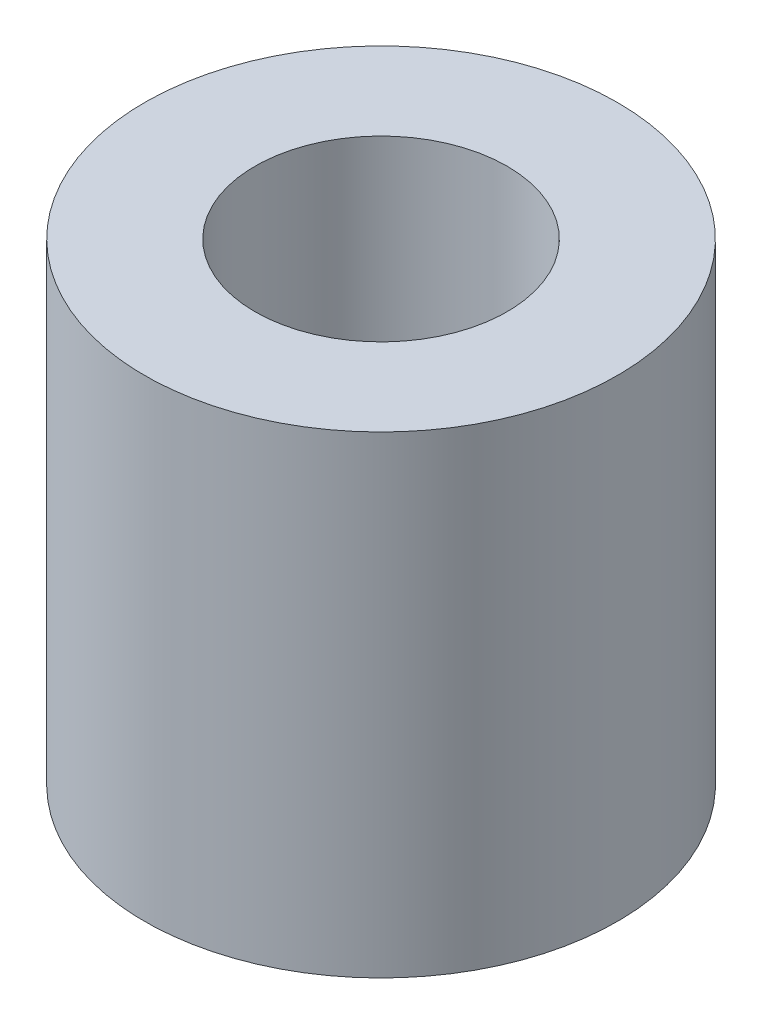
ISO-10303-21;
HEADER;
FILE_DESCRIPTION(('STEP AP214'),'2;1');
FILE_NAME('part.step','',(''),(''),'','','');
FILE_SCHEMA(('AUTOMOTIVE_DESIGN { 1 0 10303 214 1 1 1 1 }'));
ENDSEC;
DATA;
#1=APPLICATION_CONTEXT('core data for automotive mechanical design processes');
#2=APPLICATION_PROTOCOL_DEFINITION('international standard','automotive_design',2000,#1);
#3=PRODUCT_CONTEXT('',#1,'mechanical');
#4=PRODUCT('Part','Part','',(#3));
#5=PRODUCT_RELATED_PRODUCT_CATEGORY('part','',(#4));
#6=PRODUCT_DEFINITION_FORMATION('','',#4);
#7=PRODUCT_DEFINITION_CONTEXT('part definition',#1,'design');
#8=PRODUCT_DEFINITION('design','',#6,#7);
#9=PRODUCT_DEFINITION_SHAPE('','',#8);
#10=(LENGTH_UNIT() NAMED_UNIT(*) SI_UNIT(.MILLI.,.METRE.));
#11=(NAMED_UNIT(*) PLANE_ANGLE_UNIT() SI_UNIT($,.RADIAN.));
#12=(NAMED_UNIT(*) SI_UNIT($,.STERADIAN.) SOLID_ANGLE_UNIT());
#13=UNCERTAINTY_MEASURE_WITH_UNIT(LENGTH_MEASURE(1.E-05),#10,'distance_accuracy_value','');
#14=(GEOMETRIC_REPRESENTATION_CONTEXT(3) GLOBAL_UNCERTAINTY_ASSIGNED_CONTEXT((#13)) GLOBAL_UNIT_ASSIGNED_CONTEXT((#10,
#11,#12)) REPRESENTATION_CONTEXT('',''));
#15=CARTESIAN_POINT('',(0.,0.,0.));
#16=DIRECTION('',(0.,0.,1.));
#17=DIRECTION('',(1.,0.,0.));
#18=AXIS2_PLACEMENT_3D('',#15,#16,#17);
#19=CARTESIAN_POINT('',(0.,9.525,0.));
#20=DIRECTION('',(0.,1.,0.));
#21=DIRECTION('',(0.,0.,1.));
#22=AXIS2_PLACEMENT_3D('',#19,#20,#21);
#23=PLANE('',#22);
#24=CARTESIAN_POINT('',(0.,9.525,0.));
#25=DIRECTION('',(0.,1.,0.));
#26=DIRECTION('',(0.,0.,1.));
#27=AXIS2_PLACEMENT_3D('',#24,#25,#26);
#28=CIRCLE('',#27,4.7625);
#29=CARTESIAN_POINT('',(0.,9.525,-4.7625));
#30=VERTEX_POINT('',#29);
#31=EDGE_CURVE('E10',#30,#30,#28,.T.);
#32=ORIENTED_EDGE('',*,*,#31,.T.);
#33=EDGE_LOOP('',(#32));
#34=FACE_BOUND('',#33,.T.);
#35=CARTESIAN_POINT('',(0.,9.525,0.));
#36=DIRECTION('',(0.,1.,0.));
#37=DIRECTION('',(0.,0.,1.));
#38=AXIS2_PLACEMENT_3D('',#35,#36,#37);
#39=CIRCLE('',#38,2.54);
#40=CARTESIAN_POINT('',(0.,9.525,-2.54));
#41=VERTEX_POINT('',#40);
#42=EDGE_CURVE('E47',#41,#41,#39,.T.);
#43=ORIENTED_EDGE('',*,*,#42,.F.);
#44=EDGE_LOOP('',(#43));
#45=FACE_BOUND('',#44,.T.);
#46=ADVANCED_FACE('F36',(#34,#45),#23,.T.);
#47=CARTESIAN_POINT('',(0.,0.,0.));
#48=DIRECTION('',(0.,1.,0.));
#49=DIRECTION('',(0.,0.,1.));
#50=AXIS2_PLACEMENT_3D('',#47,#48,#49);
#51=PLANE('',#50);
#52=CARTESIAN_POINT('',(0.,0.,0.));
#53=DIRECTION('',(0.,1.,0.));
#54=DIRECTION('',(0.,0.,1.));
#55=AXIS2_PLACEMENT_3D('',#52,#53,#54);
#56=CIRCLE('',#55,4.7625);
#57=CARTESIAN_POINT('',(0.,0.,-4.7625));
#58=VERTEX_POINT('',#57);
#59=EDGE_CURVE('E40',#58,#58,#56,.T.);
#60=ORIENTED_EDGE('',*,*,#59,.F.);
#61=EDGE_LOOP('',(#60));
#62=FACE_BOUND('',#61,.T.);
#63=CARTESIAN_POINT('',(0.,0.,0.));
#64=DIRECTION('',(0.,1.,0.));
#65=DIRECTION('',(0.,0.,1.));
#66=AXIS2_PLACEMENT_3D('',#63,#64,#65);
#67=CIRCLE('',#66,2.54);
#68=CARTESIAN_POINT('',(0.,0.,-2.54));
#69=VERTEX_POINT('',#68);
#70=EDGE_CURVE('E49',#69,#69,#67,.T.);
#71=ORIENTED_EDGE('',*,*,#70,.T.);
#72=EDGE_LOOP('',(#71));
#73=FACE_BOUND('',#72,.T.);
#74=ADVANCED_FACE('F59',(#62,#73),#51,.F.);
#75=CARTESIAN_POINT('',(0.,9.525,0.));
#76=DIRECTION('',(0.,-1.,0.));
#77=DIRECTION('',(0.,0.,-1.));
#78=AXIS2_PLACEMENT_3D('',#75,#76,#77);
#79=CYLINDRICAL_SURFACE('',#78,4.7625);
#80=CARTESIAN_POINT('',(0.,9.525,-4.7625));
#81=CARTESIAN_POINT('',(0.,9.42578125,-4.7625));
#82=CARTESIAN_POINT('',(0.,9.3265625,-4.7625));
#83=CARTESIAN_POINT('',(0.,9.128125,-4.7625));
#84=CARTESIAN_POINT('',(0.,9.02890625,-4.7625));
#85=CARTESIAN_POINT('',(0.,8.83046875,-4.7625));
#86=CARTESIAN_POINT('',(0.,8.73125,-4.7625));
#87=CARTESIAN_POINT('',(0.,8.5328125,-4.7625));
#88=CARTESIAN_POINT('',(0.,8.43359375,-4.7625));
#89=CARTESIAN_POINT('',(0.,8.23515625,-4.7625));
#90=CARTESIAN_POINT('',(0.,8.1359375,-4.7625));
#91=CARTESIAN_POINT('',(0.,7.9375,-4.7625));
#92=CARTESIAN_POINT('',(0.,7.83828125,-4.7625));
#93=CARTESIAN_POINT('',(0.,7.63984375,-4.7625));
#94=CARTESIAN_POINT('',(0.,7.540625,-4.7625));
#95=CARTESIAN_POINT('',(0.,7.3421875,-4.7625));
#96=CARTESIAN_POINT('',(0.,7.24296875,-4.7625));
#97=CARTESIAN_POINT('',(0.,7.04453125,-4.7625));
#98=CARTESIAN_POINT('',(0.,6.9453125,-4.7625));
#99=CARTESIAN_POINT('',(0.,6.746875,-4.7625));
#100=CARTESIAN_POINT('',(0.,6.64765625,-4.7625));
#101=CARTESIAN_POINT('',(0.,6.44921875,-4.7625));
#102=CARTESIAN_POINT('',(0.,6.35,-4.7625));
#103=CARTESIAN_POINT('',(0.,6.1515625,-4.7625));
#104=CARTESIAN_POINT('',(0.,6.05234375,-4.7625));
#105=CARTESIAN_POINT('',(0.,5.85390625,-4.7625));
#106=CARTESIAN_POINT('',(0.,5.7546875,-4.7625));
#107=CARTESIAN_POINT('',(0.,5.55625,-4.7625));
#108=CARTESIAN_POINT('',(0.,5.45703125,-4.7625));
#109=CARTESIAN_POINT('',(0.,5.25859375,-4.7625));
#110=CARTESIAN_POINT('',(0.,5.159375,-4.7625));
#111=CARTESIAN_POINT('',(0.,4.9609375,-4.7625));
#112=CARTESIAN_POINT('',(0.,4.86171875,-4.7625));
#113=CARTESIAN_POINT('',(0.,4.66328125,-4.7625));
#114=CARTESIAN_POINT('',(0.,4.5640625,-4.7625));
#115=CARTESIAN_POINT('',(0.,4.365625,-4.7625));
#116=CARTESIAN_POINT('',(0.,4.26640625,-4.7625));
#117=CARTESIAN_POINT('',(0.,4.06796875,-4.7625));
#118=CARTESIAN_POINT('',(0.,3.96875,-4.7625));
#119=CARTESIAN_POINT('',(0.,3.7703125,-4.7625));
#120=CARTESIAN_POINT('',(0.,3.67109375,-4.7625));
#121=CARTESIAN_POINT('',(0.,3.47265625,-4.7625));
#122=CARTESIAN_POINT('',(0.,3.3734375,-4.7625));
#123=CARTESIAN_POINT('',(0.,3.175,-4.7625));
#124=CARTESIAN_POINT('',(0.,3.07578125,-4.7625));
#125=CARTESIAN_POINT('',(0.,2.87734375,-4.7625));
#126=CARTESIAN_POINT('',(0.,2.778125,-4.7625));
#127=CARTESIAN_POINT('',(0.,2.5796875,-4.7625));
#128=CARTESIAN_POINT('',(0.,2.48046875,-4.7625));
#129=CARTESIAN_POINT('',(0.,2.28203125,-4.7625));
#130=CARTESIAN_POINT('',(0.,2.1828125,-4.7625));
#131=CARTESIAN_POINT('',(0.,1.984375,-4.7625));
#132=CARTESIAN_POINT('',(0.,1.88515625,-4.7625));
#133=CARTESIAN_POINT('',(0.,1.68671875,-4.7625));
#134=CARTESIAN_POINT('',(0.,1.5875,-4.7625));
#135=CARTESIAN_POINT('',(0.,1.3890625,-4.7625));
#136=CARTESIAN_POINT('',(0.,1.28984375,-4.7625));
#137=CARTESIAN_POINT('',(0.,1.09140625,-4.7625));
#138=CARTESIAN_POINT('',(0.,0.992187500000001,-4.7625));
#139=CARTESIAN_POINT('',(0.,0.793750000000001,-4.7625));
#140=CARTESIAN_POINT('',(0.,0.69453125,-4.7625));
#141=CARTESIAN_POINT('',(0.,0.49609375,-4.7625));
#142=CARTESIAN_POINT('',(0.,0.396875,-4.7625));
#143=CARTESIAN_POINT('',(0.,0.1984375,-4.7625));
#144=CARTESIAN_POINT('',(0.,0.0992187500000001,-4.7625));
#145=CARTESIAN_POINT('',(0.,0.,-4.7625));
#146=B_SPLINE_CURVE_WITH_KNOTS('',3,(#80,#81,#82,#83,#84,#85,#86,#87,#88,#89,#90,#91,#92,#93,
#94,#95,#96,#97,#98,#99,#100,#101,#102,#103,#104,#105,#106,#107,#108,#109,#110,#111,#112,#113,
#114,#115,#116,#117,#118,#119,#120,#121,#122,#123,#124,#125,#126,#127,#128,#129,#130,#131,#132,
#133,#134,#135,#136,#137,#138,#139,#140,#141,#142,#143,#144,#145),.UNSPECIFIED.,.F.,.F.,(4,2,2,
2,2,2,2,2,2,2,2,2,2,2,2,2,2,2,2,2,2,2,2,2,2,2,2,2,2,2,2,2,4),(0.,0.29765625,0.5953125,
0.892968750000001,1.190625,1.48828125,1.7859375,2.08359375,2.38125,2.67890625,2.9765625,
3.27421875,3.571875,3.86953125,4.1671875,4.46484375,4.7625,5.06015625,5.3578125,5.65546875,
5.953125,6.25078125,6.5484375,6.84609375,7.14375,7.44140625,7.7390625,8.03671875,8.334375,
8.63203125,8.9296875,9.22734375,9.525),.UNSPECIFIED.);
#147=EDGE_CURVE('BSEAM38',#30,#58,#146,.T.);
#148=ORIENTED_EDGE('',*,*,#31,.F.);
#149=ORIENTED_EDGE('',*,*,#59,.T.);
#150=ORIENTED_EDGE('',*,*,#147,.T.);
#151=ORIENTED_EDGE('',*,*,#147,.F.);
#152=EDGE_LOOP('',(#148,#150,#149,#151));
#153=FACE_BOUND('',#152,.T.);
#154=ADVANCED_FACE('F38',(#153),#79,.T.);
#155=CARTESIAN_POINT('',(0.,9.525,0.));
#156=DIRECTION('',(0.,-1.,0.));
#157=DIRECTION('',(0.,0.,-1.));
#158=AXIS2_PLACEMENT_3D('',#155,#156,#157);
#159=CYLINDRICAL_SURFACE('',#158,2.54);
#160=CARTESIAN_POINT('',(0.,9.525,-2.54));
#161=CARTESIAN_POINT('',(0.,9.42578125,-2.54));
#162=CARTESIAN_POINT('',(0.,9.3265625,-2.54));
#163=CARTESIAN_POINT('',(0.,9.128125,-2.54));
#164=CARTESIAN_POINT('',(0.,9.02890625,-2.54));
#165=CARTESIAN_POINT('',(0.,8.83046875,-2.54));
#166=CARTESIAN_POINT('',(0.,8.73125,-2.54));
#167=CARTESIAN_POINT('',(0.,8.5328125,-2.54));
#168=CARTESIAN_POINT('',(0.,8.43359375,-2.54));
#169=CARTESIAN_POINT('',(0.,8.23515625,-2.54));
#170=CARTESIAN_POINT('',(0.,8.1359375,-2.54));
#171=CARTESIAN_POINT('',(0.,7.9375,-2.54));
#172=CARTESIAN_POINT('',(0.,7.83828125,-2.54));
#173=CARTESIAN_POINT('',(0.,7.63984375,-2.54));
#174=CARTESIAN_POINT('',(0.,7.540625,-2.54));
#175=CARTESIAN_POINT('',(0.,7.3421875,-2.54));
#176=CARTESIAN_POINT('',(0.,7.24296875,-2.54));
#177=CARTESIAN_POINT('',(0.,7.04453125,-2.54));
#178=CARTESIAN_POINT('',(0.,6.9453125,-2.54));
#179=CARTESIAN_POINT('',(0.,6.746875,-2.54));
#180=CARTESIAN_POINT('',(0.,6.64765625,-2.54));
#181=CARTESIAN_POINT('',(0.,6.44921875,-2.54));
#182=CARTESIAN_POINT('',(0.,6.35,-2.54));
#183=CARTESIAN_POINT('',(0.,6.1515625,-2.54));
#184=CARTESIAN_POINT('',(0.,6.05234375,-2.54));
#185=CARTESIAN_POINT('',(0.,5.85390625,-2.54));
#186=CARTESIAN_POINT('',(0.,5.7546875,-2.54));
#187=CARTESIAN_POINT('',(0.,5.55625,-2.54));
#188=CARTESIAN_POINT('',(0.,5.45703125,-2.54));
#189=CARTESIAN_POINT('',(0.,5.25859375,-2.54));
#190=CARTESIAN_POINT('',(0.,5.159375,-2.54));
#191=CARTESIAN_POINT('',(0.,4.9609375,-2.54));
#192=CARTESIAN_POINT('',(0.,4.86171875,-2.54));
#193=CARTESIAN_POINT('',(0.,4.66328125,-2.54));
#194=CARTESIAN_POINT('',(0.,4.5640625,-2.54));
#195=CARTESIAN_POINT('',(0.,4.365625,-2.54));
#196=CARTESIAN_POINT('',(0.,4.26640625,-2.54));
#197=CARTESIAN_POINT('',(0.,4.06796875,-2.54));
#198=CARTESIAN_POINT('',(0.,3.96875,-2.54));
#199=CARTESIAN_POINT('',(0.,3.7703125,-2.54));
#200=CARTESIAN_POINT('',(0.,3.67109375,-2.54));
#201=CARTESIAN_POINT('',(0.,3.47265625,-2.54));
#202=CARTESIAN_POINT('',(0.,3.3734375,-2.54));
#203=CARTESIAN_POINT('',(0.,3.175,-2.54));
#204=CARTESIAN_POINT('',(0.,3.07578125,-2.54));
#205=CARTESIAN_POINT('',(0.,2.87734375,-2.54));
#206=CARTESIAN_POINT('',(0.,2.778125,-2.54));
#207=CARTESIAN_POINT('',(0.,2.5796875,-2.54));
#208=CARTESIAN_POINT('',(0.,2.48046875,-2.54));
#209=CARTESIAN_POINT('',(0.,2.28203125,-2.54));
#210=CARTESIAN_POINT('',(0.,2.1828125,-2.54));
#211=CARTESIAN_POINT('',(0.,1.984375,-2.54));
#212=CARTESIAN_POINT('',(0.,1.88515625,-2.54));
#213=CARTESIAN_POINT('',(0.,1.68671875,-2.54));
#214=CARTESIAN_POINT('',(0.,1.5875,-2.54));
#215=CARTESIAN_POINT('',(0.,1.3890625,-2.54));
#216=CARTESIAN_POINT('',(0.,1.28984375,-2.54));
#217=CARTESIAN_POINT('',(0.,1.09140625,-2.54));
#218=CARTESIAN_POINT('',(0.,0.992187500000001,-2.54));
#219=CARTESIAN_POINT('',(0.,0.793750000000001,-2.54));
#220=CARTESIAN_POINT('',(0.,0.69453125,-2.54));
#221=CARTESIAN_POINT('',(0.,0.49609375,-2.54));
#222=CARTESIAN_POINT('',(0.,0.396875,-2.54));
#223=CARTESIAN_POINT('',(0.,0.1984375,-2.54));
#224=CARTESIAN_POINT('',(0.,0.0992187500000001,-2.54));
#225=CARTESIAN_POINT('',(0.,0.,-2.54));
#226=B_SPLINE_CURVE_WITH_KNOTS('',3,(#160,#161,#162,#163,#164,#165,#166,#167,#168,#169,#170,
#171,#172,#173,#174,#175,#176,#177,#178,#179,#180,#181,#182,#183,#184,#185,#186,#187,#188,#189,
#190,#191,#192,#193,#194,#195,#196,#197,#198,#199,#200,#201,#202,#203,#204,#205,#206,#207,#208,
#209,#210,#211,#212,#213,#214,#215,#216,#217,#218,#219,#220,#221,#222,#223,#224,#225),
.UNSPECIFIED.,.F.,.F.,(4,2,2,2,2,2,2,2,2,2,2,2,2,2,2,2,2,2,2,2,2,2,2,2,2,2,2,2,2,2,2,2,4),(0.,
0.297656249999998,0.595312499999999,0.892968749999999,1.190625,1.48828125,1.7859375,2.08359375,
2.38125,2.67890625,2.9765625,3.27421875,3.571875,3.86953125,4.1671875,4.46484375,4.7625,
5.06015625,5.3578125,5.65546875,5.953125,6.25078125,6.5484375,6.84609375,7.14375,7.44140625,
7.7390625,8.03671875,8.334375,8.63203125,8.9296875,9.22734375,9.525),.UNSPECIFIED.);
#227=EDGE_CURVE('BSEAM55',#41,#69,#226,.T.);
#228=ORIENTED_EDGE('',*,*,#42,.T.);
#229=ORIENTED_EDGE('',*,*,#70,.F.);
#230=ORIENTED_EDGE('',*,*,#227,.T.);
#231=ORIENTED_EDGE('',*,*,#227,.F.);
#232=EDGE_LOOP('',(#228,#230,#229,#231));
#233=FACE_BOUND('',#232,.T.);
#234=ADVANCED_FACE('F55',(#233),#159,.F.);
#235=CLOSED_SHELL('',(#46,#74,#154,#234));
#236=MANIFOLD_SOLID_BREP('B2',#235);
#237=ADVANCED_BREP_SHAPE_REPRESENTATION('',(#18,#236),#14);
#238=SHAPE_DEFINITION_REPRESENTATION(#9,#237);
ENDSEC;
END-ISO-10303-21;
